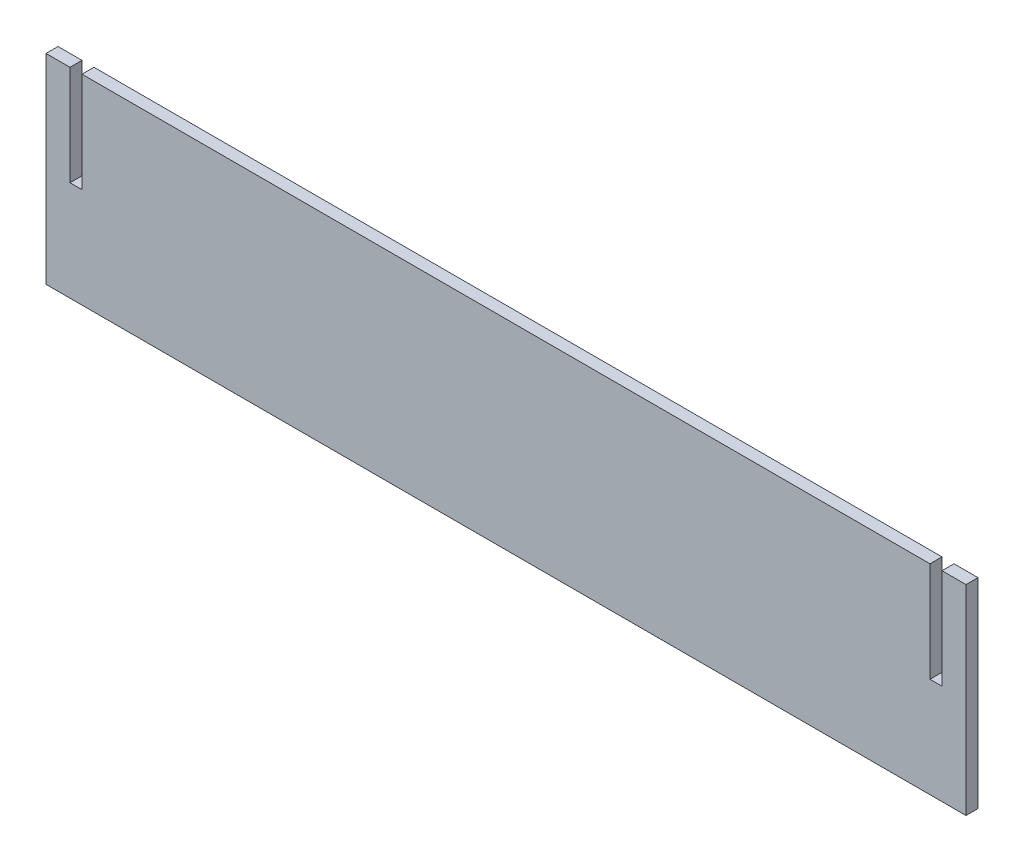
ISO-10303-21;
HEADER;
FILE_DESCRIPTION(('STEP AP214'),'2;1');
FILE_NAME('part.step','',(''),(''),'','','');
FILE_SCHEMA(('AUTOMOTIVE_DESIGN { 1 0 10303 214 1 1 1 1 }'));
ENDSEC;
DATA;
#1=APPLICATION_CONTEXT('core data for automotive mechanical design processes');
#2=APPLICATION_PROTOCOL_DEFINITION('international standard','automotive_design',2000,#1);
#3=PRODUCT_CONTEXT('',#1,'mechanical');
#4=PRODUCT('Part','Part','',(#3));
#5=PRODUCT_RELATED_PRODUCT_CATEGORY('part','',(#4));
#6=PRODUCT_DEFINITION_FORMATION('','',#4);
#7=PRODUCT_DEFINITION_CONTEXT('part definition',#1,'design');
#8=PRODUCT_DEFINITION('design','',#6,#7);
#9=PRODUCT_DEFINITION_SHAPE('','',#8);
#10=(LENGTH_UNIT() NAMED_UNIT(*) SI_UNIT(.MILLI.,.METRE.));
#11=(NAMED_UNIT(*) PLANE_ANGLE_UNIT() SI_UNIT($,.RADIAN.));
#12=(NAMED_UNIT(*) SI_UNIT($,.STERADIAN.) SOLID_ANGLE_UNIT());
#13=UNCERTAINTY_MEASURE_WITH_UNIT(LENGTH_MEASURE(1.E-05),#10,'distance_accuracy_value','');
#14=(GEOMETRIC_REPRESENTATION_CONTEXT(3) GLOBAL_UNCERTAINTY_ASSIGNED_CONTEXT((#13)) GLOBAL_UNIT_ASSIGNED_CONTEXT((#10,
#11,#12)) REPRESENTATION_CONTEXT('',''));
#15=CARTESIAN_POINT('',(0.,0.,0.));
#16=DIRECTION('',(0.,0.,1.));
#17=DIRECTION('',(1.,0.,0.));
#18=AXIS2_PLACEMENT_3D('',#15,#16,#17);
#19=CARTESIAN_POINT('',(-115.,25.,3.));
#20=DIRECTION('',(1.,0.,0.));
#21=DIRECTION('',(0.,1.,0.));
#22=AXIS2_PLACEMENT_3D('',#19,#20,#21);
#23=PLANE('',#22);
#24=DIRECTION('',(0.,-1.,0.));
#25=VECTOR('',#24,1.);
#26=CARTESIAN_POINT('',(-115.,25.,0.));
#27=LINE('',#26,#25);
#28=CARTESIAN_POINT('',(-115.,25.,0.));
#29=VERTEX_POINT('',#28);
#30=CARTESIAN_POINT('',(-115.,-25.,0.));
#31=VERTEX_POINT('',#30);
#32=EDGE_CURVE('E153',#29,#31,#27,.T.);
#33=ORIENTED_EDGE('',*,*,#32,.T.);
#34=DIRECTION('',(0.,0.,-1.));
#35=VECTOR('',#34,1.);
#36=CARTESIAN_POINT('',(-115.,-25.,3.));
#37=LINE('',#36,#35);
#38=CARTESIAN_POINT('',(-115.,-25.,3.));
#39=VERTEX_POINT('',#38);
#40=EDGE_CURVE('E11',#39,#31,#37,.T.);
#41=ORIENTED_EDGE('',*,*,#40,.F.);
#42=DIRECTION('',(0.,-1.,0.));
#43=VECTOR('',#42,1.);
#44=CARTESIAN_POINT('',(-115.,25.,3.));
#45=LINE('',#44,#43);
#46=CARTESIAN_POINT('',(-115.,25.,3.));
#47=VERTEX_POINT('',#46);
#48=EDGE_CURVE('E175',#47,#39,#45,.T.);
#49=ORIENTED_EDGE('',*,*,#48,.F.);
#50=DIRECTION('',(0.,0.,-1.));
#51=VECTOR('',#50,1.);
#52=CARTESIAN_POINT('',(-115.,25.,3.));
#53=LINE('',#52,#51);
#54=EDGE_CURVE('E149',#47,#29,#53,.T.);
#55=ORIENTED_EDGE('',*,*,#54,.T.);
#56=EDGE_LOOP('',(#33,#41,#49,#55));
#57=FACE_BOUND('',#56,.T.);
#58=ADVANCED_FACE('F33',(#57),#23,.F.);
#59=CARTESIAN_POINT('',(-115.,-25.,3.));
#60=DIRECTION('',(0.,1.,0.));
#61=DIRECTION('',(0.,0.,1.));
#62=AXIS2_PLACEMENT_3D('',#59,#60,#61);
#63=PLANE('',#62);
#64=DIRECTION('',(1.,0.,0.));
#65=VECTOR('',#64,1.);
#66=CARTESIAN_POINT('',(-115.,-25.,0.));
#67=LINE('',#66,#65);
#68=CARTESIAN_POINT('',(115.,-25.,0.));
#69=VERTEX_POINT('',#68);
#70=EDGE_CURVE('E156',#31,#69,#67,.T.);
#71=ORIENTED_EDGE('',*,*,#70,.T.);
#72=DIRECTION('',(0.,0.,-1.));
#73=VECTOR('',#72,1.);
#74=CARTESIAN_POINT('',(115.,-25.,3.));
#75=LINE('',#74,#73);
#76=CARTESIAN_POINT('',(115.,-25.,3.));
#77=VERTEX_POINT('',#76);
#78=EDGE_CURVE('E41',#77,#69,#75,.T.);
#79=ORIENTED_EDGE('',*,*,#78,.F.);
#80=DIRECTION('',(1.,0.,0.));
#81=VECTOR('',#80,1.);
#82=CARTESIAN_POINT('',(-115.,-25.,3.));
#83=LINE('',#82,#81);
#84=EDGE_CURVE('E104',#39,#77,#83,.T.);
#85=ORIENTED_EDGE('',*,*,#84,.F.);
#86=ORIENTED_EDGE('',*,*,#40,.T.);
#87=EDGE_LOOP('',(#71,#79,#85,#86));
#88=FACE_BOUND('',#87,.T.);
#89=ADVANCED_FACE('F253',(#88),#63,.F.);
#90=CARTESIAN_POINT('',(115.,25.,3.));
#91=DIRECTION('',(-1.,0.,0.));
#92=DIRECTION('',(0.,-1.,0.));
#93=AXIS2_PLACEMENT_3D('',#90,#91,#92);
#94=PLANE('',#93);
#95=DIRECTION('',(0.,1.,0.));
#96=VECTOR('',#95,1.);
#97=CARTESIAN_POINT('',(115.,25.,0.));
#98=LINE('',#97,#96);
#99=CARTESIAN_POINT('',(115.,25.,0.));
#100=VERTEX_POINT('',#99);
#101=EDGE_CURVE('E158',#69,#100,#98,.T.);
#102=ORIENTED_EDGE('',*,*,#101,.T.);
#103=DIRECTION('',(0.,0.,-1.));
#104=VECTOR('',#103,1.);
#105=CARTESIAN_POINT('',(115.,25.,3.));
#106=LINE('',#105,#104);
#107=CARTESIAN_POINT('',(115.,25.,3.));
#108=VERTEX_POINT('',#107);
#109=EDGE_CURVE('E194',#108,#100,#106,.T.);
#110=ORIENTED_EDGE('',*,*,#109,.F.);
#111=DIRECTION('',(0.,1.,0.));
#112=VECTOR('',#111,1.);
#113=CARTESIAN_POINT('',(115.,25.,3.));
#114=LINE('',#113,#112);
#115=EDGE_CURVE('E202',#77,#108,#114,.T.);
#116=ORIENTED_EDGE('',*,*,#115,.F.);
#117=ORIENTED_EDGE('',*,*,#78,.T.);
#118=EDGE_LOOP('',(#102,#110,#116,#117));
#119=FACE_BOUND('',#118,.T.);
#120=ADVANCED_FACE('F200',(#119),#94,.F.);
#121=CARTESIAN_POINT('',(109.,25.,3.));
#122=DIRECTION('',(0.,-1.,0.));
#123=DIRECTION('',(1.,0.,0.));
#124=AXIS2_PLACEMENT_3D('',#121,#122,#123);
#125=PLANE('',#124);
#126=DIRECTION('',(-1.,0.,0.));
#127=VECTOR('',#126,1.);
#128=CARTESIAN_POINT('',(109.,25.,0.));
#129=LINE('',#128,#127);
#130=CARTESIAN_POINT('',(109.,25.,0.));
#131=VERTEX_POINT('',#130);
#132=EDGE_CURVE('E160',#100,#131,#129,.T.);
#133=ORIENTED_EDGE('',*,*,#132,.T.);
#134=DIRECTION('',(0.,0.,-1.));
#135=VECTOR('',#134,1.);
#136=CARTESIAN_POINT('',(109.,25.,3.));
#137=LINE('',#136,#135);
#138=CARTESIAN_POINT('',(109.,25.,3.));
#139=VERTEX_POINT('',#138);
#140=EDGE_CURVE('E191',#139,#131,#137,.T.);
#141=ORIENTED_EDGE('',*,*,#140,.F.);
#142=DIRECTION('',(-1.,0.,0.));
#143=VECTOR('',#142,1.);
#144=CARTESIAN_POINT('',(109.,25.,3.));
#145=LINE('',#144,#143);
#146=EDGE_CURVE('E220',#108,#139,#145,.T.);
#147=ORIENTED_EDGE('',*,*,#146,.F.);
#148=ORIENTED_EDGE('',*,*,#109,.T.);
#149=EDGE_LOOP('',(#133,#141,#147,#148));
#150=FACE_BOUND('',#149,.T.);
#151=ADVANCED_FACE('F211',(#150),#125,.F.);
#152=CARTESIAN_POINT('',(109.,25.,3.));
#153=DIRECTION('',(1.,0.,0.));
#154=DIRECTION('',(0.,1.,0.));
#155=AXIS2_PLACEMENT_3D('',#152,#153,#154);
#156=PLANE('',#155);
#157=DIRECTION('',(0.,-1.,0.));
#158=VECTOR('',#157,1.);
#159=CARTESIAN_POINT('',(109.,25.,0.));
#160=LINE('',#159,#158);
#161=CARTESIAN_POINT('',(109.,0.,0.));
#162=VERTEX_POINT('',#161);
#163=EDGE_CURVE('E162',#131,#162,#160,.T.);
#164=ORIENTED_EDGE('',*,*,#163,.T.);
#165=DIRECTION('',(0.,0.,-1.));
#166=VECTOR('',#165,1.);
#167=CARTESIAN_POINT('',(109.,0.,3.));
#168=LINE('',#167,#166);
#169=CARTESIAN_POINT('',(109.,0.,3.));
#170=VERTEX_POINT('',#169);
#171=EDGE_CURVE('E188',#170,#162,#168,.T.);
#172=ORIENTED_EDGE('',*,*,#171,.F.);
#173=DIRECTION('',(0.,-1.,0.));
#174=VECTOR('',#173,1.);
#175=CARTESIAN_POINT('',(109.,25.,3.));
#176=LINE('',#175,#174);
#177=EDGE_CURVE('E217',#139,#170,#176,.T.);
#178=ORIENTED_EDGE('',*,*,#177,.F.);
#179=ORIENTED_EDGE('',*,*,#140,.T.);
#180=EDGE_LOOP('',(#164,#172,#178,#179));
#181=FACE_BOUND('',#180,.T.);
#182=ADVANCED_FACE('F215',(#181),#156,.F.);
#183=CARTESIAN_POINT('',(109.,0.,3.));
#184=DIRECTION('',(0.,-1.,0.));
#185=DIRECTION('',(0.,0.,-1.));
#186=AXIS2_PLACEMENT_3D('',#183,#184,#185);
#187=PLANE('',#186);
#188=DIRECTION('',(-1.,0.,0.));
#189=VECTOR('',#188,1.);
#190=CARTESIAN_POINT('',(109.,0.,0.));
#191=LINE('',#190,#189);
#192=CARTESIAN_POINT('',(106.,0.,0.));
#193=VERTEX_POINT('',#192);
#194=EDGE_CURVE('E164',#162,#193,#191,.T.);
#195=ORIENTED_EDGE('',*,*,#194,.T.);
#196=DIRECTION('',(0.,0.,-1.));
#197=VECTOR('',#196,1.);
#198=CARTESIAN_POINT('',(106.,0.,3.));
#199=LINE('',#198,#197);
#200=CARTESIAN_POINT('',(106.,0.,3.));
#201=VERTEX_POINT('',#200);
#202=EDGE_CURVE('E185',#201,#193,#199,.T.);
#203=ORIENTED_EDGE('',*,*,#202,.F.);
#204=DIRECTION('',(-1.,0.,0.));
#205=VECTOR('',#204,1.);
#206=CARTESIAN_POINT('',(109.,0.,3.));
#207=LINE('',#206,#205);
#208=EDGE_CURVE('E219',#170,#201,#207,.T.);
#209=ORIENTED_EDGE('',*,*,#208,.F.);
#210=ORIENTED_EDGE('',*,*,#171,.T.);
#211=EDGE_LOOP('',(#195,#203,#209,#210));
#212=FACE_BOUND('',#211,.T.);
#213=ADVANCED_FACE('F266',(#212),#187,.F.);
#214=CARTESIAN_POINT('',(106.,0.,3.));
#215=DIRECTION('',(-1.,0.,0.));
#216=DIRECTION('',(0.,0.,1.));
#217=AXIS2_PLACEMENT_3D('',#214,#215,#216);
#218=PLANE('',#217);
#219=DIRECTION('',(0.,1.,0.));
#220=VECTOR('',#219,1.);
#221=CARTESIAN_POINT('',(106.,0.,0.));
#222=LINE('',#221,#220);
#223=CARTESIAN_POINT('',(106.,25.,0.));
#224=VERTEX_POINT('',#223);
#225=EDGE_CURVE('E166',#193,#224,#222,.T.);
#226=ORIENTED_EDGE('',*,*,#225,.T.);
#227=DIRECTION('',(0.,0.,-1.));
#228=VECTOR('',#227,1.);
#229=CARTESIAN_POINT('',(106.,25.,3.));
#230=LINE('',#229,#228);
#231=CARTESIAN_POINT('',(106.,25.,3.));
#232=VERTEX_POINT('',#231);
#233=EDGE_CURVE('E182',#232,#224,#230,.T.);
#234=ORIENTED_EDGE('',*,*,#233,.F.);
#235=DIRECTION('',(0.,1.,0.));
#236=VECTOR('',#235,1.);
#237=CARTESIAN_POINT('',(106.,0.,3.));
#238=LINE('',#237,#236);
#239=EDGE_CURVE('E222',#201,#232,#238,.T.);
#240=ORIENTED_EDGE('',*,*,#239,.F.);
#241=ORIENTED_EDGE('',*,*,#202,.T.);
#242=EDGE_LOOP('',(#226,#234,#240,#241));
#243=FACE_BOUND('',#242,.T.);
#244=ADVANCED_FACE('F269',(#243),#218,.F.);
#245=CARTESIAN_POINT('',(-106.,25.,3.));
#246=DIRECTION('',(0.,-1.,0.));
#247=DIRECTION('',(0.,0.,-1.));
#248=AXIS2_PLACEMENT_3D('',#245,#246,#247);
#249=PLANE('',#248);
#250=DIRECTION('',(-1.,0.,0.));
#251=VECTOR('',#250,1.);
#252=CARTESIAN_POINT('',(-106.,25.,0.));
#253=LINE('',#252,#251);
#254=CARTESIAN_POINT('',(-106.,25.,0.));
#255=VERTEX_POINT('',#254);
#256=EDGE_CURVE('E168',#224,#255,#253,.T.);
#257=ORIENTED_EDGE('',*,*,#256,.T.);
#258=DIRECTION('',(0.,0.,-1.));
#259=VECTOR('',#258,1.);
#260=CARTESIAN_POINT('',(-106.,25.,3.));
#261=LINE('',#260,#259);
#262=CARTESIAN_POINT('',(-106.,25.,3.));
#263=VERTEX_POINT('',#262);
#264=EDGE_CURVE('E179',#263,#255,#261,.T.);
#265=ORIENTED_EDGE('',*,*,#264,.F.);
#266=DIRECTION('',(-1.,0.,0.));
#267=VECTOR('',#266,1.);
#268=CARTESIAN_POINT('',(-106.,25.,3.));
#269=LINE('',#268,#267);
#270=EDGE_CURVE('E228',#232,#263,#269,.T.);
#271=ORIENTED_EDGE('',*,*,#270,.F.);
#272=ORIENTED_EDGE('',*,*,#233,.T.);
#273=EDGE_LOOP('',(#257,#265,#271,#272));
#274=FACE_BOUND('',#273,.T.);
#275=ADVANCED_FACE('F234',(#274),#249,.F.);
#276=CARTESIAN_POINT('',(-106.,0.,3.));
#277=DIRECTION('',(1.,0.,0.));
#278=DIRECTION('',(0.,0.,-1.));
#279=AXIS2_PLACEMENT_3D('',#276,#277,#278);
#280=PLANE('',#279);
#281=DIRECTION('',(0.,-1.,0.));
#282=VECTOR('',#281,1.);
#283=CARTESIAN_POINT('',(-106.,0.,0.));
#284=LINE('',#283,#282);
#285=CARTESIAN_POINT('',(-106.,0.,0.));
#286=VERTEX_POINT('',#285);
#287=EDGE_CURVE('E170',#255,#286,#284,.T.);
#288=ORIENTED_EDGE('',*,*,#287,.T.);
#289=DIRECTION('',(0.,0.,-1.));
#290=VECTOR('',#289,1.);
#291=CARTESIAN_POINT('',(-106.,0.,3.));
#292=LINE('',#291,#290);
#293=CARTESIAN_POINT('',(-106.,0.,3.));
#294=VERTEX_POINT('',#293);
#295=EDGE_CURVE('E144',#294,#286,#292,.T.);
#296=ORIENTED_EDGE('',*,*,#295,.F.);
#297=DIRECTION('',(0.,-1.,0.));
#298=VECTOR('',#297,1.);
#299=CARTESIAN_POINT('',(-106.,0.,3.));
#300=LINE('',#299,#298);
#301=EDGE_CURVE('E135',#263,#294,#300,.T.);
#302=ORIENTED_EDGE('',*,*,#301,.F.);
#303=ORIENTED_EDGE('',*,*,#264,.T.);
#304=EDGE_LOOP('',(#288,#296,#302,#303));
#305=FACE_BOUND('',#304,.T.);
#306=ADVANCED_FACE('F238',(#305),#280,.F.);
#307=CARTESIAN_POINT('',(-109.,0.,3.));
#308=DIRECTION('',(0.,-1.,0.));
#309=DIRECTION('',(0.,0.,-1.));
#310=AXIS2_PLACEMENT_3D('',#307,#308,#309);
#311=PLANE('',#310);
#312=DIRECTION('',(-1.,0.,0.));
#313=VECTOR('',#312,1.);
#314=CARTESIAN_POINT('',(-109.,0.,0.));
#315=LINE('',#314,#313);
#316=CARTESIAN_POINT('',(-109.,0.,0.));
#317=VERTEX_POINT('',#316);
#318=EDGE_CURVE('E143',#286,#317,#315,.T.);
#319=ORIENTED_EDGE('',*,*,#318,.T.);
#320=DIRECTION('',(0.,0.,-1.));
#321=VECTOR('',#320,1.);
#322=CARTESIAN_POINT('',(-109.,0.,3.));
#323=LINE('',#322,#321);
#324=CARTESIAN_POINT('',(-109.,0.,3.));
#325=VERTEX_POINT('',#324);
#326=EDGE_CURVE('E140',#325,#317,#323,.T.);
#327=ORIENTED_EDGE('',*,*,#326,.F.);
#328=DIRECTION('',(-1.,0.,0.));
#329=VECTOR('',#328,1.);
#330=CARTESIAN_POINT('',(-109.,0.,3.));
#331=LINE('',#330,#329);
#332=EDGE_CURVE('E129',#294,#325,#331,.T.);
#333=ORIENTED_EDGE('',*,*,#332,.F.);
#334=ORIENTED_EDGE('',*,*,#295,.T.);
#335=EDGE_LOOP('',(#319,#327,#333,#334));
#336=FACE_BOUND('',#335,.T.);
#337=ADVANCED_FACE('F141',(#336),#311,.F.);
#338=CARTESIAN_POINT('',(-109.,25.,3.));
#339=DIRECTION('',(-1.,0.,0.));
#340=DIRECTION('',(0.,-1.,0.));
#341=AXIS2_PLACEMENT_3D('',#338,#339,#340);
#342=PLANE('',#341);
#343=DIRECTION('',(0.,1.,0.));
#344=VECTOR('',#343,1.);
#345=CARTESIAN_POINT('',(-109.,25.,0.));
#346=LINE('',#345,#344);
#347=CARTESIAN_POINT('',(-109.,25.,0.));
#348=VERTEX_POINT('',#347);
#349=EDGE_CURVE('E90',#317,#348,#346,.T.);
#350=ORIENTED_EDGE('',*,*,#349,.T.);
#351=DIRECTION('',(0.,0.,-1.));
#352=VECTOR('',#351,1.);
#353=CARTESIAN_POINT('',(-109.,25.,3.));
#354=LINE('',#353,#352);
#355=CARTESIAN_POINT('',(-109.,25.,3.));
#356=VERTEX_POINT('',#355);
#357=EDGE_CURVE('E145',#356,#348,#354,.T.);
#358=ORIENTED_EDGE('',*,*,#357,.F.);
#359=DIRECTION('',(0.,1.,0.));
#360=VECTOR('',#359,1.);
#361=CARTESIAN_POINT('',(-109.,25.,3.));
#362=LINE('',#361,#360);
#363=EDGE_CURVE('E133',#325,#356,#362,.T.);
#364=ORIENTED_EDGE('',*,*,#363,.F.);
#365=ORIENTED_EDGE('',*,*,#326,.T.);
#366=EDGE_LOOP('',(#350,#358,#364,#365));
#367=FACE_BOUND('',#366,.T.);
#368=ADVANCED_FACE('F147',(#367),#342,.F.);
#369=CARTESIAN_POINT('',(-115.,25.,3.));
#370=DIRECTION('',(0.,-1.,0.));
#371=DIRECTION('',(1.,0.,0.));
#372=AXIS2_PLACEMENT_3D('',#369,#370,#371);
#373=PLANE('',#372);
#374=DIRECTION('',(-1.,0.,0.));
#375=VECTOR('',#374,1.);
#376=CARTESIAN_POINT('',(-115.,25.,0.));
#377=LINE('',#376,#375);
#378=EDGE_CURVE('E96',#348,#29,#377,.T.);
#379=ORIENTED_EDGE('',*,*,#378,.T.);
#380=ORIENTED_EDGE('',*,*,#54,.F.);
#381=DIRECTION('',(-1.,0.,0.));
#382=VECTOR('',#381,1.);
#383=CARTESIAN_POINT('',(-115.,25.,3.));
#384=LINE('',#383,#382);
#385=EDGE_CURVE('E49',#356,#47,#384,.T.);
#386=ORIENTED_EDGE('',*,*,#385,.F.);
#387=ORIENTED_EDGE('',*,*,#357,.T.);
#388=EDGE_LOOP('',(#379,#380,#386,#387));
#389=FACE_BOUND('',#388,.T.);
#390=ADVANCED_FACE('F242',(#389),#373,.F.);
#391=CARTESIAN_POINT('',(0.,0.,3.));
#392=DIRECTION('',(0.,0.,1.));
#393=DIRECTION('',(1.,0.,0.));
#394=AXIS2_PLACEMENT_3D('',#391,#392,#393);
#395=PLANE('',#394);
#396=ORIENTED_EDGE('',*,*,#48,.T.);
#397=ORIENTED_EDGE('',*,*,#84,.T.);
#398=ORIENTED_EDGE('',*,*,#115,.T.);
#399=ORIENTED_EDGE('',*,*,#146,.T.);
#400=ORIENTED_EDGE('',*,*,#177,.T.);
#401=ORIENTED_EDGE('',*,*,#208,.T.);
#402=ORIENTED_EDGE('',*,*,#239,.T.);
#403=ORIENTED_EDGE('',*,*,#270,.T.);
#404=ORIENTED_EDGE('',*,*,#301,.T.);
#405=ORIENTED_EDGE('',*,*,#332,.T.);
#406=ORIENTED_EDGE('',*,*,#363,.T.);
#407=ORIENTED_EDGE('',*,*,#385,.T.);
#408=EDGE_LOOP('',(#396,#397,#398,#399,#400,#401,#402,#403,#404,#405,#406,#407));
#409=FACE_BOUND('',#408,.T.);
#410=ADVANCED_FACE('F131',(#409),#395,.T.);
#411=CARTESIAN_POINT('',(0.,0.,0.));
#412=DIRECTION('',(0.,0.,1.));
#413=DIRECTION('',(1.,0.,0.));
#414=AXIS2_PLACEMENT_3D('',#411,#412,#413);
#415=PLANE('',#414);
#416=ORIENTED_EDGE('',*,*,#32,.F.);
#417=ORIENTED_EDGE('',*,*,#378,.F.);
#418=ORIENTED_EDGE('',*,*,#349,.F.);
#419=ORIENTED_EDGE('',*,*,#318,.F.);
#420=ORIENTED_EDGE('',*,*,#287,.F.);
#421=ORIENTED_EDGE('',*,*,#256,.F.);
#422=ORIENTED_EDGE('',*,*,#225,.F.);
#423=ORIENTED_EDGE('',*,*,#194,.F.);
#424=ORIENTED_EDGE('',*,*,#163,.F.);
#425=ORIENTED_EDGE('',*,*,#132,.F.);
#426=ORIENTED_EDGE('',*,*,#101,.F.);
#427=ORIENTED_EDGE('',*,*,#70,.F.);
#428=EDGE_LOOP('',(#416,#417,#418,#419,#420,#421,#422,#423,#424,#425,#426,#427));
#429=FACE_BOUND('',#428,.T.);
#430=ADVANCED_FACE('F206',(#429),#415,.F.);
#431=CLOSED_SHELL('',(#58,#89,#120,#151,#182,#213,#244,#275,#306,#337,#368,#390,#410,#430));
#432=MANIFOLD_SOLID_BREP('B2',#431);
#433=ADVANCED_BREP_SHAPE_REPRESENTATION('',(#18,#432),#14);
#434=SHAPE_DEFINITION_REPRESENTATION(#9,#433);
ENDSEC;
END-ISO-10303-21;
